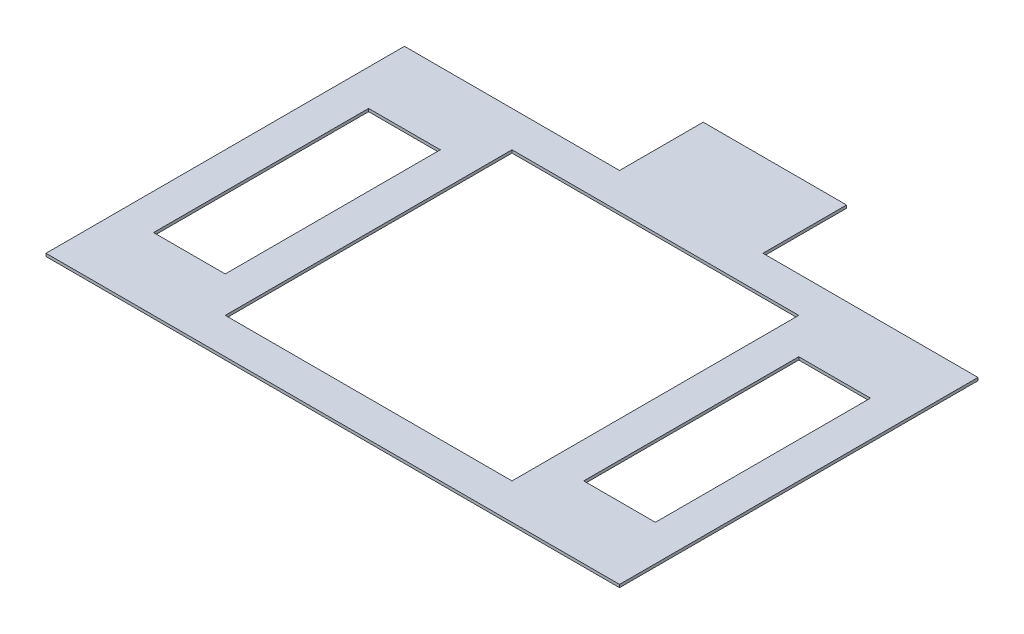
ISO-10303-21;
HEADER;
FILE_DESCRIPTION(('STEP AP214'),'2;1');
FILE_NAME('part.step','',(''),(''),'','','');
FILE_SCHEMA(('AUTOMOTIVE_DESIGN { 1 0 10303 214 1 1 1 1 }'));
ENDSEC;
DATA;
#1=APPLICATION_CONTEXT('core data for automotive mechanical design processes');
#2=APPLICATION_PROTOCOL_DEFINITION('international standard','automotive_design',2000,#1);
#3=PRODUCT_CONTEXT('',#1,'mechanical');
#4=PRODUCT('Part','Part','',(#3));
#5=PRODUCT_RELATED_PRODUCT_CATEGORY('part','',(#4));
#6=PRODUCT_DEFINITION_FORMATION('','',#4);
#7=PRODUCT_DEFINITION_CONTEXT('part definition',#1,'design');
#8=PRODUCT_DEFINITION('design','',#6,#7);
#9=PRODUCT_DEFINITION_SHAPE('','',#8);
#10=(LENGTH_UNIT() NAMED_UNIT(*) SI_UNIT(.MILLI.,.METRE.));
#11=(NAMED_UNIT(*) PLANE_ANGLE_UNIT() SI_UNIT($,.RADIAN.));
#12=(NAMED_UNIT(*) SI_UNIT($,.STERADIAN.) SOLID_ANGLE_UNIT());
#13=UNCERTAINTY_MEASURE_WITH_UNIT(LENGTH_MEASURE(1.E-05),#10,'distance_accuracy_value','');
#14=(GEOMETRIC_REPRESENTATION_CONTEXT(3) GLOBAL_UNCERTAINTY_ASSIGNED_CONTEXT((#13)) GLOBAL_UNIT_ASSIGNED_CONTEXT((#10,
#11,#12)) REPRESENTATION_CONTEXT('',''));
#15=CARTESIAN_POINT('',(0.,0.,0.));
#16=DIRECTION('',(0.,0.,1.));
#17=DIRECTION('',(1.,0.,0.));
#18=AXIS2_PLACEMENT_3D('',#15,#16,#17);
#19=CARTESIAN_POINT('',(0.,3.,0.));
#20=DIRECTION('',(0.,-1.,0.));
#21=DIRECTION('',(0.,0.,-1.));
#22=AXIS2_PLACEMENT_3D('',#19,#20,#21);
#23=PLANE('',#22);
#24=DIRECTION('',(0.,0.,1.));
#25=VECTOR('',#24,1.);
#26=CARTESIAN_POINT('',(37.5,3.,-300.));
#27=LINE('',#26,#25);
#28=CARTESIAN_POINT('',(37.5,3.,-300.));
#29=VERTEX_POINT('',#28);
#30=CARTESIAN_POINT('',(37.5,3.,-75.));
#31=VERTEX_POINT('',#30);
#32=EDGE_CURVE('E225',#29,#31,#27,.T.);
#33=ORIENTED_EDGE('',*,*,#32,.F.);
#34=DIRECTION('',(-1.,0.,0.));
#35=VECTOR('',#34,1.);
#36=CARTESIAN_POINT('',(37.5,3.,-300.));
#37=LINE('',#36,#35);
#38=CARTESIAN_POINT('',(112.5,3.,-300.));
#39=VERTEX_POINT('',#38);
#40=EDGE_CURVE('E236',#39,#29,#37,.T.);
#41=ORIENTED_EDGE('',*,*,#40,.F.);
#42=DIRECTION('',(0.,0.,-1.));
#43=VECTOR('',#42,1.);
#44=CARTESIAN_POINT('',(112.5,3.,-300.));
#45=LINE('',#44,#43);
#46=CARTESIAN_POINT('',(112.5,3.,-75.));
#47=VERTEX_POINT('',#46);
#48=EDGE_CURVE('E232',#47,#39,#45,.T.);
#49=ORIENTED_EDGE('',*,*,#48,.F.);
#50=DIRECTION('',(1.,0.,0.));
#51=VECTOR('',#50,1.);
#52=CARTESIAN_POINT('',(37.5,3.,-75.));
#53=LINE('',#52,#51);
#54=EDGE_CURVE('E228',#31,#47,#53,.T.);
#55=ORIENTED_EDGE('',*,*,#54,.F.);
#56=EDGE_LOOP('',(#33,#41,#49,#55));
#57=FACE_BOUND('',#56,.T.);
#58=DIRECTION('',(1.,0.,0.));
#59=VECTOR('',#58,1.);
#60=CARTESIAN_POINT('',(600.,3.,0.));
#61=LINE('',#60,#59);
#62=CARTESIAN_POINT('',(0.,3.,0.));
#63=VERTEX_POINT('',#62);
#64=CARTESIAN_POINT('',(600.,3.,0.));
#65=VERTEX_POINT('',#64);
#66=EDGE_CURVE('E311',#63,#65,#61,.T.);
#67=ORIENTED_EDGE('',*,*,#66,.T.);
#68=DIRECTION('',(0.,0.,-1.));
#69=VECTOR('',#68,1.);
#70=CARTESIAN_POINT('',(600.,3.,-375.));
#71=LINE('',#70,#69);
#72=CARTESIAN_POINT('',(600.,3.,-375.));
#73=VERTEX_POINT('',#72);
#74=EDGE_CURVE('E315',#65,#73,#71,.T.);
#75=ORIENTED_EDGE('',*,*,#74,.T.);
#76=DIRECTION('',(-1.,0.,0.));
#77=VECTOR('',#76,1.);
#78=CARTESIAN_POINT('',(375.,3.,-375.));
#79=LINE('',#78,#77);
#80=CARTESIAN_POINT('',(375.,3.,-375.));
#81=VERTEX_POINT('',#80);
#82=EDGE_CURVE('E319',#73,#81,#79,.T.);
#83=ORIENTED_EDGE('',*,*,#82,.T.);
#84=DIRECTION('',(0.,0.,-1.));
#85=VECTOR('',#84,1.);
#86=CARTESIAN_POINT('',(375.,3.,-462.5));
#87=LINE('',#86,#85);
#88=CARTESIAN_POINT('',(375.,3.,-462.5));
#89=VERTEX_POINT('',#88);
#90=EDGE_CURVE('E322',#81,#89,#87,.T.);
#91=ORIENTED_EDGE('',*,*,#90,.T.);
#92=DIRECTION('',(-1.,0.,0.));
#93=VECTOR('',#92,1.);
#94=CARTESIAN_POINT('',(225.,3.,-462.5));
#95=LINE('',#94,#93);
#96=CARTESIAN_POINT('',(225.,3.,-462.5));
#97=VERTEX_POINT('',#96);
#98=EDGE_CURVE('E325',#89,#97,#95,.T.);
#99=ORIENTED_EDGE('',*,*,#98,.T.);
#100=DIRECTION('',(0.,0.,1.));
#101=VECTOR('',#100,1.);
#102=CARTESIAN_POINT('',(225.,3.,-375.));
#103=LINE('',#102,#101);
#104=CARTESIAN_POINT('',(225.,3.,-375.));
#105=VERTEX_POINT('',#104);
#106=EDGE_CURVE('E328',#97,#105,#103,.T.);
#107=ORIENTED_EDGE('',*,*,#106,.T.);
#108=DIRECTION('',(-1.,0.,0.));
#109=VECTOR('',#108,1.);
#110=CARTESIAN_POINT('',(-1.11022302462516E-13,3.,-375.));
#111=LINE('',#110,#109);
#112=CARTESIAN_POINT('',(-1.11022302462516E-13,3.,-375.));
#113=VERTEX_POINT('',#112);
#114=EDGE_CURVE('E331',#105,#113,#111,.T.);
#115=ORIENTED_EDGE('',*,*,#114,.T.);
#116=DIRECTION('',(0.,0.,1.));
#117=VECTOR('',#116,1.);
#118=CARTESIAN_POINT('',(0.,3.,0.));
#119=LINE('',#118,#117);
#120=EDGE_CURVE('E334',#113,#63,#119,.T.);
#121=ORIENTED_EDGE('',*,*,#120,.T.);
#122=EDGE_LOOP('',(#67,#75,#83,#91,#99,#107,#115,#121));
#123=FACE_BOUND('',#122,.T.);
#124=DIRECTION('',(0.,0.,1.));
#125=VECTOR('',#124,1.);
#126=CARTESIAN_POINT('',(150.,3.,-337.5));
#127=LINE('',#126,#125);
#128=CARTESIAN_POINT('',(150.,3.,-337.5));
#129=VERTEX_POINT('',#128);
#130=CARTESIAN_POINT('',(150.,3.,-37.5));
#131=VERTEX_POINT('',#130);
#132=EDGE_CURVE('E268',#129,#131,#127,.T.);
#133=ORIENTED_EDGE('',*,*,#132,.F.);
#134=DIRECTION('',(-1.,0.,0.));
#135=VECTOR('',#134,1.);
#136=CARTESIAN_POINT('',(150.,3.,-337.5));
#137=LINE('',#136,#135);
#138=CARTESIAN_POINT('',(450.,3.,-337.5));
#139=VERTEX_POINT('',#138);
#140=EDGE_CURVE('E279',#139,#129,#137,.T.);
#141=ORIENTED_EDGE('',*,*,#140,.F.);
#142=DIRECTION('',(0.,0.,-1.));
#143=VECTOR('',#142,1.);
#144=CARTESIAN_POINT('',(450.,3.,-337.5));
#145=LINE('',#144,#143);
#146=CARTESIAN_POINT('',(450.,3.,-37.5));
#147=VERTEX_POINT('',#146);
#148=EDGE_CURVE('E275',#147,#139,#145,.T.);
#149=ORIENTED_EDGE('',*,*,#148,.F.);
#150=DIRECTION('',(1.,0.,0.));
#151=VECTOR('',#150,1.);
#152=CARTESIAN_POINT('',(150.,3.,-37.5));
#153=LINE('',#152,#151);
#154=EDGE_CURVE('E271',#131,#147,#153,.T.);
#155=ORIENTED_EDGE('',*,*,#154,.F.);
#156=EDGE_LOOP('',(#133,#141,#149,#155));
#157=FACE_BOUND('',#156,.T.);
#158=DIRECTION('',(0.,0.,1.));
#159=VECTOR('',#158,1.);
#160=CARTESIAN_POINT('',(487.5,3.,-300.));
#161=LINE('',#160,#159);
#162=CARTESIAN_POINT('',(487.5,3.,-300.));
#163=VERTEX_POINT('',#162);
#164=CARTESIAN_POINT('',(487.5,3.,-75.));
#165=VERTEX_POINT('',#164);
#166=EDGE_CURVE('E177',#163,#165,#161,.T.);
#167=ORIENTED_EDGE('',*,*,#166,.F.);
#168=DIRECTION('',(-1.,0.,0.));
#169=VECTOR('',#168,1.);
#170=CARTESIAN_POINT('',(487.5,3.,-300.));
#171=LINE('',#170,#169);
#172=CARTESIAN_POINT('',(562.5,3.,-300.));
#173=VERTEX_POINT('',#172);
#174=EDGE_CURVE('E203',#173,#163,#171,.T.);
#175=ORIENTED_EDGE('',*,*,#174,.F.);
#176=DIRECTION('',(0.,0.,-1.));
#177=VECTOR('',#176,1.);
#178=CARTESIAN_POINT('',(562.5,3.,-300.));
#179=LINE('',#178,#177);
#180=CARTESIAN_POINT('',(562.5,3.,-75.));
#181=VERTEX_POINT('',#180);
#182=EDGE_CURVE('E199',#181,#173,#179,.T.);
#183=ORIENTED_EDGE('',*,*,#182,.F.);
#184=DIRECTION('',(1.,0.,0.));
#185=VECTOR('',#184,1.);
#186=CARTESIAN_POINT('',(487.5,3.,-75.));
#187=LINE('',#186,#185);
#188=EDGE_CURVE('E186',#165,#181,#187,.T.);
#189=ORIENTED_EDGE('',*,*,#188,.F.);
#190=EDGE_LOOP('',(#167,#175,#183,#189));
#191=FACE_BOUND('',#190,.T.);
#192=ADVANCED_FACE('F39',(#57,#123,#157,#191),#23,.F.);
#193=CARTESIAN_POINT('',(0.,0.,0.));
#194=DIRECTION('',(0.,-1.,0.));
#195=DIRECTION('',(0.,0.,-1.));
#196=AXIS2_PLACEMENT_3D('',#193,#194,#195);
#197=PLANE('',#196);
#198=DIRECTION('',(1.,0.,0.));
#199=VECTOR('',#198,1.);
#200=CARTESIAN_POINT('',(600.,0.,0.));
#201=LINE('',#200,#199);
#202=CARTESIAN_POINT('',(0.,0.,0.));
#203=VERTEX_POINT('',#202);
#204=CARTESIAN_POINT('',(600.,0.,0.));
#205=VERTEX_POINT('',#204);
#206=EDGE_CURVE('E310',#203,#205,#201,.T.);
#207=ORIENTED_EDGE('',*,*,#206,.F.);
#208=DIRECTION('',(0.,0.,1.));
#209=VECTOR('',#208,1.);
#210=CARTESIAN_POINT('',(0.,0.,0.));
#211=LINE('',#210,#209);
#212=CARTESIAN_POINT('',(-1.11022302462516E-13,0.,-375.));
#213=VERTEX_POINT('',#212);
#214=EDGE_CURVE('E316',#213,#203,#211,.T.);
#215=ORIENTED_EDGE('',*,*,#214,.F.);
#216=DIRECTION('',(-1.,0.,0.));
#217=VECTOR('',#216,1.);
#218=CARTESIAN_POINT('',(-1.11022302462516E-13,0.,-375.));
#219=LINE('',#218,#217);
#220=CARTESIAN_POINT('',(225.,0.,-375.));
#221=VERTEX_POINT('',#220);
#222=EDGE_CURVE('E356',#221,#213,#219,.T.);
#223=ORIENTED_EDGE('',*,*,#222,.F.);
#224=DIRECTION('',(0.,0.,1.));
#225=VECTOR('',#224,1.);
#226=CARTESIAN_POINT('',(225.,0.,-375.));
#227=LINE('',#226,#225);
#228=CARTESIAN_POINT('',(225.,0.,-462.5));
#229=VERTEX_POINT('',#228);
#230=EDGE_CURVE('E353',#229,#221,#227,.T.);
#231=ORIENTED_EDGE('',*,*,#230,.F.);
#232=DIRECTION('',(-1.,0.,0.));
#233=VECTOR('',#232,1.);
#234=CARTESIAN_POINT('',(225.,0.,-462.5));
#235=LINE('',#234,#233);
#236=CARTESIAN_POINT('',(375.,0.,-462.5));
#237=VERTEX_POINT('',#236);
#238=EDGE_CURVE('E350',#237,#229,#235,.T.);
#239=ORIENTED_EDGE('',*,*,#238,.F.);
#240=DIRECTION('',(0.,0.,-1.));
#241=VECTOR('',#240,1.);
#242=CARTESIAN_POINT('',(375.,0.,-462.5));
#243=LINE('',#242,#241);
#244=CARTESIAN_POINT('',(375.,0.,-375.));
#245=VERTEX_POINT('',#244);
#246=EDGE_CURVE('E347',#245,#237,#243,.T.);
#247=ORIENTED_EDGE('',*,*,#246,.F.);
#248=DIRECTION('',(-1.,0.,0.));
#249=VECTOR('',#248,1.);
#250=CARTESIAN_POINT('',(375.,0.,-375.));
#251=LINE('',#250,#249);
#252=CARTESIAN_POINT('',(600.,0.,-375.));
#253=VERTEX_POINT('',#252);
#254=EDGE_CURVE('E344',#253,#245,#251,.T.);
#255=ORIENTED_EDGE('',*,*,#254,.F.);
#256=DIRECTION('',(0.,0.,-1.));
#257=VECTOR('',#256,1.);
#258=CARTESIAN_POINT('',(600.,0.,-375.));
#259=LINE('',#258,#257);
#260=EDGE_CURVE('E341',#205,#253,#259,.T.);
#261=ORIENTED_EDGE('',*,*,#260,.F.);
#262=EDGE_LOOP('',(#207,#215,#223,#231,#239,#247,#255,#261));
#263=FACE_BOUND('',#262,.T.);
#264=DIRECTION('',(-1.,0.,0.));
#265=VECTOR('',#264,1.);
#266=CARTESIAN_POINT('',(150.,0.,-337.5));
#267=LINE('',#266,#265);
#268=CARTESIAN_POINT('',(450.,0.,-337.5));
#269=VERTEX_POINT('',#268);
#270=CARTESIAN_POINT('',(150.,0.,-337.5));
#271=VERTEX_POINT('',#270);
#272=EDGE_CURVE('E272',#269,#271,#267,.T.);
#273=ORIENTED_EDGE('',*,*,#272,.T.);
#274=DIRECTION('',(0.,0.,1.));
#275=VECTOR('',#274,1.);
#276=CARTESIAN_POINT('',(150.,0.,-337.5));
#277=LINE('',#276,#275);
#278=CARTESIAN_POINT('',(150.,0.,-37.5));
#279=VERTEX_POINT('',#278);
#280=EDGE_CURVE('E267',#271,#279,#277,.T.);
#281=ORIENTED_EDGE('',*,*,#280,.T.);
#282=DIRECTION('',(1.,0.,0.));
#283=VECTOR('',#282,1.);
#284=CARTESIAN_POINT('',(150.,0.,-37.5));
#285=LINE('',#284,#283);
#286=CARTESIAN_POINT('',(450.,0.,-37.5));
#287=VERTEX_POINT('',#286);
#288=EDGE_CURVE('E286',#279,#287,#285,.T.);
#289=ORIENTED_EDGE('',*,*,#288,.T.);
#290=DIRECTION('',(0.,0.,-1.));
#291=VECTOR('',#290,1.);
#292=CARTESIAN_POINT('',(450.,0.,-337.5));
#293=LINE('',#292,#291);
#294=EDGE_CURVE('E290',#287,#269,#293,.T.);
#295=ORIENTED_EDGE('',*,*,#294,.T.);
#296=EDGE_LOOP('',(#273,#281,#289,#295));
#297=FACE_BOUND('',#296,.T.);
#298=DIRECTION('',(-1.,0.,0.));
#299=VECTOR('',#298,1.);
#300=CARTESIAN_POINT('',(37.5,0.,-300.));
#301=LINE('',#300,#299);
#302=CARTESIAN_POINT('',(112.5,0.,-300.));
#303=VERTEX_POINT('',#302);
#304=CARTESIAN_POINT('',(37.5,0.,-300.));
#305=VERTEX_POINT('',#304);
#306=EDGE_CURVE('E229',#303,#305,#301,.T.);
#307=ORIENTED_EDGE('',*,*,#306,.T.);
#308=DIRECTION('',(0.,0.,1.));
#309=VECTOR('',#308,1.);
#310=CARTESIAN_POINT('',(37.5,0.,-300.));
#311=LINE('',#310,#309);
#312=CARTESIAN_POINT('',(37.5,0.,-75.));
#313=VERTEX_POINT('',#312);
#314=EDGE_CURVE('E195',#305,#313,#311,.T.);
#315=ORIENTED_EDGE('',*,*,#314,.T.);
#316=DIRECTION('',(1.,0.,0.));
#317=VECTOR('',#316,1.);
#318=CARTESIAN_POINT('',(37.5,0.,-75.));
#319=LINE('',#318,#317);
#320=CARTESIAN_POINT('',(112.5,0.,-75.));
#321=VERTEX_POINT('',#320);
#322=EDGE_CURVE('E243',#313,#321,#319,.T.);
#323=ORIENTED_EDGE('',*,*,#322,.T.);
#324=DIRECTION('',(0.,0.,-1.));
#325=VECTOR('',#324,1.);
#326=CARTESIAN_POINT('',(112.5,0.,-300.));
#327=LINE('',#326,#325);
#328=EDGE_CURVE('E247',#321,#303,#327,.T.);
#329=ORIENTED_EDGE('',*,*,#328,.T.);
#330=EDGE_LOOP('',(#307,#315,#323,#329));
#331=FACE_BOUND('',#330,.T.);
#332=DIRECTION('',(-1.,0.,0.));
#333=VECTOR('',#332,1.);
#334=CARTESIAN_POINT('',(487.5,0.,-300.));
#335=LINE('',#334,#333);
#336=CARTESIAN_POINT('',(562.5,0.,-300.));
#337=VERTEX_POINT('',#336);
#338=CARTESIAN_POINT('',(487.5,0.,-300.));
#339=VERTEX_POINT('',#338);
#340=EDGE_CURVE('E187',#337,#339,#335,.T.);
#341=ORIENTED_EDGE('',*,*,#340,.T.);
#342=DIRECTION('',(0.,0.,1.));
#343=VECTOR('',#342,1.);
#344=CARTESIAN_POINT('',(487.5,0.,-300.));
#345=LINE('',#344,#343);
#346=CARTESIAN_POINT('',(487.5,0.,-75.));
#347=VERTEX_POINT('',#346);
#348=EDGE_CURVE('E63',#339,#347,#345,.T.);
#349=ORIENTED_EDGE('',*,*,#348,.T.);
#350=DIRECTION('',(1.,0.,0.));
#351=VECTOR('',#350,1.);
#352=CARTESIAN_POINT('',(487.5,0.,-75.));
#353=LINE('',#352,#351);
#354=CARTESIAN_POINT('',(562.5,0.,-75.));
#355=VERTEX_POINT('',#354);
#356=EDGE_CURVE('E193',#347,#355,#353,.T.);
#357=ORIENTED_EDGE('',*,*,#356,.T.);
#358=DIRECTION('',(0.,0.,-1.));
#359=VECTOR('',#358,1.);
#360=CARTESIAN_POINT('',(562.5,0.,-300.));
#361=LINE('',#360,#359);
#362=EDGE_CURVE('E212',#355,#337,#361,.T.);
#363=ORIENTED_EDGE('',*,*,#362,.T.);
#364=EDGE_LOOP('',(#341,#349,#357,#363));
#365=FACE_BOUND('',#364,.T.);
#366=ADVANCED_FACE('F395',(#263,#297,#331,#365),#197,.T.);
#367=CARTESIAN_POINT('',(600.,3.,0.));
#368=DIRECTION('',(0.,0.,-1.));
#369=DIRECTION('',(-1.,0.,0.));
#370=AXIS2_PLACEMENT_3D('',#367,#368,#369);
#371=PLANE('',#370);
#372=ORIENTED_EDGE('',*,*,#206,.T.);
#373=DIRECTION('',(0.,-1.,0.));
#374=VECTOR('',#373,1.);
#375=CARTESIAN_POINT('',(600.,3.,0.));
#376=LINE('',#375,#374);
#377=EDGE_CURVE('E11',#65,#205,#376,.T.);
#378=ORIENTED_EDGE('',*,*,#377,.F.);
#379=ORIENTED_EDGE('',*,*,#66,.F.);
#380=DIRECTION('',(0.,-1.,0.));
#381=VECTOR('',#380,1.);
#382=CARTESIAN_POINT('',(0.,3.,0.));
#383=LINE('',#382,#381);
#384=EDGE_CURVE('E337',#63,#203,#383,.T.);
#385=ORIENTED_EDGE('',*,*,#384,.T.);
#386=EDGE_LOOP('',(#372,#378,#379,#385));
#387=FACE_BOUND('',#386,.T.);
#388=ADVANCED_FACE('F41',(#387),#371,.F.);
#389=CARTESIAN_POINT('',(600.,3.,-375.));
#390=DIRECTION('',(-1.,0.,0.));
#391=DIRECTION('',(0.,0.,1.));
#392=AXIS2_PLACEMENT_3D('',#389,#390,#391);
#393=PLANE('',#392);
#394=ORIENTED_EDGE('',*,*,#260,.T.);
#395=DIRECTION('',(0.,-1.,0.));
#396=VECTOR('',#395,1.);
#397=CARTESIAN_POINT('',(600.,3.,-375.));
#398=LINE('',#397,#396);
#399=EDGE_CURVE('E48',#73,#253,#398,.T.);
#400=ORIENTED_EDGE('',*,*,#399,.F.);
#401=ORIENTED_EDGE('',*,*,#74,.F.);
#402=ORIENTED_EDGE('',*,*,#377,.T.);
#403=EDGE_LOOP('',(#394,#400,#401,#402));
#404=FACE_BOUND('',#403,.T.);
#405=ADVANCED_FACE('F413',(#404),#393,.F.);
#406=CARTESIAN_POINT('',(375.,3.,-375.));
#407=DIRECTION('',(0.,0.,1.));
#408=DIRECTION('',(1.,0.,0.));
#409=AXIS2_PLACEMENT_3D('',#406,#407,#408);
#410=PLANE('',#409);
#411=ORIENTED_EDGE('',*,*,#254,.T.);
#412=DIRECTION('',(0.,-1.,0.));
#413=VECTOR('',#412,1.);
#414=CARTESIAN_POINT('',(375.,3.,-375.));
#415=LINE('',#414,#413);
#416=EDGE_CURVE('E380',#81,#245,#415,.T.);
#417=ORIENTED_EDGE('',*,*,#416,.F.);
#418=ORIENTED_EDGE('',*,*,#82,.F.);
#419=ORIENTED_EDGE('',*,*,#399,.T.);
#420=EDGE_LOOP('',(#411,#417,#418,#419));
#421=FACE_BOUND('',#420,.T.);
#422=ADVANCED_FACE('F389',(#421),#410,.F.);
#423=CARTESIAN_POINT('',(375.,3.,-462.5));
#424=DIRECTION('',(-1.,0.,0.));
#425=DIRECTION('',(0.,0.,1.));
#426=AXIS2_PLACEMENT_3D('',#423,#424,#425);
#427=PLANE('',#426);
#428=ORIENTED_EDGE('',*,*,#246,.T.);
#429=DIRECTION('',(0.,-1.,0.));
#430=VECTOR('',#429,1.);
#431=CARTESIAN_POINT('',(375.,3.,-462.5));
#432=LINE('',#431,#430);
#433=EDGE_CURVE('E376',#89,#237,#432,.T.);
#434=ORIENTED_EDGE('',*,*,#433,.F.);
#435=ORIENTED_EDGE('',*,*,#90,.F.);
#436=ORIENTED_EDGE('',*,*,#416,.T.);
#437=EDGE_LOOP('',(#428,#434,#435,#436));
#438=FACE_BOUND('',#437,.T.);
#439=ADVANCED_FACE('F401',(#438),#427,.F.);
#440=CARTESIAN_POINT('',(225.,3.,-462.5));
#441=DIRECTION('',(0.,0.,1.));
#442=DIRECTION('',(1.,0.,0.));
#443=AXIS2_PLACEMENT_3D('',#440,#441,#442);
#444=PLANE('',#443);
#445=ORIENTED_EDGE('',*,*,#238,.T.);
#446=DIRECTION('',(0.,-1.,0.));
#447=VECTOR('',#446,1.);
#448=CARTESIAN_POINT('',(225.,3.,-462.5));
#449=LINE('',#448,#447);
#450=EDGE_CURVE('E372',#97,#229,#449,.T.);
#451=ORIENTED_EDGE('',*,*,#450,.F.);
#452=ORIENTED_EDGE('',*,*,#98,.F.);
#453=ORIENTED_EDGE('',*,*,#433,.T.);
#454=EDGE_LOOP('',(#445,#451,#452,#453));
#455=FACE_BOUND('',#454,.T.);
#456=ADVANCED_FACE('F405',(#455),#444,.F.);
#457=CARTESIAN_POINT('',(225.,3.,-375.));
#458=DIRECTION('',(1.,0.,0.));
#459=DIRECTION('',(0.,0.,-1.));
#460=AXIS2_PLACEMENT_3D('',#457,#458,#459);
#461=PLANE('',#460);
#462=ORIENTED_EDGE('',*,*,#230,.T.);
#463=DIRECTION('',(0.,-1.,0.));
#464=VECTOR('',#463,1.);
#465=CARTESIAN_POINT('',(225.,3.,-375.));
#466=LINE('',#465,#464);
#467=EDGE_CURVE('E368',#105,#221,#466,.T.);
#468=ORIENTED_EDGE('',*,*,#467,.F.);
#469=ORIENTED_EDGE('',*,*,#106,.F.);
#470=ORIENTED_EDGE('',*,*,#450,.T.);
#471=EDGE_LOOP('',(#462,#468,#469,#470));
#472=FACE_BOUND('',#471,.T.);
#473=ADVANCED_FACE('F426',(#472),#461,.F.);
#474=CARTESIAN_POINT('',(-1.11022302462516E-13,3.,-375.));
#475=DIRECTION('',(0.,0.,1.));
#476=DIRECTION('',(1.,0.,0.));
#477=AXIS2_PLACEMENT_3D('',#474,#475,#476);
#478=PLANE('',#477);
#479=ORIENTED_EDGE('',*,*,#222,.T.);
#480=DIRECTION('',(0.,-1.,0.));
#481=VECTOR('',#480,1.);
#482=CARTESIAN_POINT('',(-1.11022302462516E-13,3.,-375.));
#483=LINE('',#482,#481);
#484=EDGE_CURVE('E364',#113,#213,#483,.T.);
#485=ORIENTED_EDGE('',*,*,#484,.F.);
#486=ORIENTED_EDGE('',*,*,#114,.F.);
#487=ORIENTED_EDGE('',*,*,#467,.T.);
#488=EDGE_LOOP('',(#479,#485,#486,#487));
#489=FACE_BOUND('',#488,.T.);
#490=ADVANCED_FACE('F424',(#489),#478,.F.);
#491=CARTESIAN_POINT('',(0.,3.,0.));
#492=DIRECTION('',(1.,0.,0.));
#493=DIRECTION('',(0.,0.,-1.));
#494=AXIS2_PLACEMENT_3D('',#491,#492,#493);
#495=PLANE('',#494);
#496=ORIENTED_EDGE('',*,*,#214,.T.);
#497=ORIENTED_EDGE('',*,*,#384,.F.);
#498=ORIENTED_EDGE('',*,*,#120,.F.);
#499=ORIENTED_EDGE('',*,*,#484,.T.);
#500=EDGE_LOOP('',(#496,#497,#498,#499));
#501=FACE_BOUND('',#500,.T.);
#502=ADVANCED_FACE('F419',(#501),#495,.F.);
#503=CARTESIAN_POINT('',(150.,3.,-337.5));
#504=DIRECTION('',(1.,0.,0.));
#505=DIRECTION('',(0.,0.,-1.));
#506=AXIS2_PLACEMENT_3D('',#503,#504,#505);
#507=PLANE('',#506);
#508=ORIENTED_EDGE('',*,*,#280,.F.);
#509=DIRECTION('',(0.,-1.,0.));
#510=VECTOR('',#509,1.);
#511=CARTESIAN_POINT('',(150.,3.,-337.5));
#512=LINE('',#511,#510);
#513=EDGE_CURVE('E282',#129,#271,#512,.T.);
#514=ORIENTED_EDGE('',*,*,#513,.F.);
#515=ORIENTED_EDGE('',*,*,#132,.T.);
#516=DIRECTION('',(0.,-1.,0.));
#517=VECTOR('',#516,1.);
#518=CARTESIAN_POINT('',(150.,3.,-37.5));
#519=LINE('',#518,#517);
#520=EDGE_CURVE('E306',#131,#279,#519,.T.);
#521=ORIENTED_EDGE('',*,*,#520,.T.);
#522=EDGE_LOOP('',(#508,#514,#515,#521));
#523=FACE_BOUND('',#522,.T.);
#524=ADVANCED_FACE('F444',(#523),#507,.T.);
#525=CARTESIAN_POINT('',(150.,3.,-37.5));
#526=DIRECTION('',(0.,0.,-1.));
#527=DIRECTION('',(-1.,0.,0.));
#528=AXIS2_PLACEMENT_3D('',#525,#526,#527);
#529=PLANE('',#528);
#530=ORIENTED_EDGE('',*,*,#288,.F.);
#531=ORIENTED_EDGE('',*,*,#520,.F.);
#532=ORIENTED_EDGE('',*,*,#154,.T.);
#533=DIRECTION('',(0.,-1.,0.));
#534=VECTOR('',#533,1.);
#535=CARTESIAN_POINT('',(450.,3.,-37.5));
#536=LINE('',#535,#534);
#537=EDGE_CURVE('E303',#147,#287,#536,.T.);
#538=ORIENTED_EDGE('',*,*,#537,.T.);
#539=EDGE_LOOP('',(#530,#531,#532,#538));
#540=FACE_BOUND('',#539,.T.);
#541=ADVANCED_FACE('F451',(#540),#529,.T.);
#542=CARTESIAN_POINT('',(450.,3.,-337.5));
#543=DIRECTION('',(-1.,0.,0.));
#544=DIRECTION('',(0.,0.,1.));
#545=AXIS2_PLACEMENT_3D('',#542,#543,#544);
#546=PLANE('',#545);
#547=ORIENTED_EDGE('',*,*,#294,.F.);
#548=ORIENTED_EDGE('',*,*,#537,.F.);
#549=ORIENTED_EDGE('',*,*,#148,.T.);
#550=DIRECTION('',(0.,-1.,0.));
#551=VECTOR('',#550,1.);
#552=CARTESIAN_POINT('',(450.,3.,-337.5));
#553=LINE('',#552,#551);
#554=EDGE_CURVE('E300',#139,#269,#553,.T.);
#555=ORIENTED_EDGE('',*,*,#554,.T.);
#556=EDGE_LOOP('',(#547,#548,#549,#555));
#557=FACE_BOUND('',#556,.T.);
#558=ADVANCED_FACE('F456',(#557),#546,.T.);
#559=CARTESIAN_POINT('',(150.,3.,-337.5));
#560=DIRECTION('',(0.,0.,1.));
#561=DIRECTION('',(1.,0.,0.));
#562=AXIS2_PLACEMENT_3D('',#559,#560,#561);
#563=PLANE('',#562);
#564=ORIENTED_EDGE('',*,*,#272,.F.);
#565=ORIENTED_EDGE('',*,*,#554,.F.);
#566=ORIENTED_EDGE('',*,*,#140,.T.);
#567=ORIENTED_EDGE('',*,*,#513,.T.);
#568=EDGE_LOOP('',(#564,#565,#566,#567));
#569=FACE_BOUND('',#568,.T.);
#570=ADVANCED_FACE('F463',(#569),#563,.T.);
#571=CARTESIAN_POINT('',(37.5,3.,-300.));
#572=DIRECTION('',(1.,0.,0.));
#573=DIRECTION('',(0.,0.,-1.));
#574=AXIS2_PLACEMENT_3D('',#571,#572,#573);
#575=PLANE('',#574);
#576=ORIENTED_EDGE('',*,*,#314,.F.);
#577=DIRECTION('',(0.,-1.,0.));
#578=VECTOR('',#577,1.);
#579=CARTESIAN_POINT('',(37.5,3.,-300.));
#580=LINE('',#579,#578);
#581=EDGE_CURVE('E239',#29,#305,#580,.T.);
#582=ORIENTED_EDGE('',*,*,#581,.F.);
#583=ORIENTED_EDGE('',*,*,#32,.T.);
#584=DIRECTION('',(0.,-1.,0.));
#585=VECTOR('',#584,1.);
#586=CARTESIAN_POINT('',(37.5,3.,-75.));
#587=LINE('',#586,#585);
#588=EDGE_CURVE('E263',#31,#313,#587,.T.);
#589=ORIENTED_EDGE('',*,*,#588,.T.);
#590=EDGE_LOOP('',(#576,#582,#583,#589));
#591=FACE_BOUND('',#590,.T.);
#592=ADVANCED_FACE('F476',(#591),#575,.T.);
#593=CARTESIAN_POINT('',(37.5,3.,-75.));
#594=DIRECTION('',(0.,0.,-1.));
#595=DIRECTION('',(-1.,0.,0.));
#596=AXIS2_PLACEMENT_3D('',#593,#594,#595);
#597=PLANE('',#596);
#598=ORIENTED_EDGE('',*,*,#322,.F.);
#599=ORIENTED_EDGE('',*,*,#588,.F.);
#600=ORIENTED_EDGE('',*,*,#54,.T.);
#601=DIRECTION('',(0.,-1.,0.));
#602=VECTOR('',#601,1.);
#603=CARTESIAN_POINT('',(112.5,3.,-75.));
#604=LINE('',#603,#602);
#605=EDGE_CURVE('E260',#47,#321,#604,.T.);
#606=ORIENTED_EDGE('',*,*,#605,.T.);
#607=EDGE_LOOP('',(#598,#599,#600,#606));
#608=FACE_BOUND('',#607,.T.);
#609=ADVANCED_FACE('F481',(#608),#597,.T.);
#610=CARTESIAN_POINT('',(112.5,3.,-300.));
#611=DIRECTION('',(-1.,0.,0.));
#612=DIRECTION('',(0.,0.,1.));
#613=AXIS2_PLACEMENT_3D('',#610,#611,#612);
#614=PLANE('',#613);
#615=ORIENTED_EDGE('',*,*,#328,.F.);
#616=ORIENTED_EDGE('',*,*,#605,.F.);
#617=ORIENTED_EDGE('',*,*,#48,.T.);
#618=DIRECTION('',(0.,-1.,0.));
#619=VECTOR('',#618,1.);
#620=CARTESIAN_POINT('',(112.5,3.,-300.));
#621=LINE('',#620,#619);
#622=EDGE_CURVE('E257',#39,#303,#621,.T.);
#623=ORIENTED_EDGE('',*,*,#622,.T.);
#624=EDGE_LOOP('',(#615,#616,#617,#623));
#625=FACE_BOUND('',#624,.T.);
#626=ADVANCED_FACE('F485',(#625),#614,.T.);
#627=CARTESIAN_POINT('',(37.5,3.,-300.));
#628=DIRECTION('',(0.,0.,1.));
#629=DIRECTION('',(1.,0.,0.));
#630=AXIS2_PLACEMENT_3D('',#627,#628,#629);
#631=PLANE('',#630);
#632=ORIENTED_EDGE('',*,*,#306,.F.);
#633=ORIENTED_EDGE('',*,*,#622,.F.);
#634=ORIENTED_EDGE('',*,*,#40,.T.);
#635=ORIENTED_EDGE('',*,*,#581,.T.);
#636=EDGE_LOOP('',(#632,#633,#634,#635));
#637=FACE_BOUND('',#636,.T.);
#638=ADVANCED_FACE('F489',(#637),#631,.T.);
#639=CARTESIAN_POINT('',(487.5,3.,-300.));
#640=DIRECTION('',(1.,0.,0.));
#641=DIRECTION('',(0.,0.,-1.));
#642=AXIS2_PLACEMENT_3D('',#639,#640,#641);
#643=PLANE('',#642);
#644=ORIENTED_EDGE('',*,*,#348,.F.);
#645=DIRECTION('',(0.,-1.,0.));
#646=VECTOR('',#645,1.);
#647=CARTESIAN_POINT('',(487.5,3.,-300.));
#648=LINE('',#647,#646);
#649=EDGE_CURVE('E181',#163,#339,#648,.T.);
#650=ORIENTED_EDGE('',*,*,#649,.F.);
#651=ORIENTED_EDGE('',*,*,#166,.T.);
#652=DIRECTION('',(0.,-1.,0.));
#653=VECTOR('',#652,1.);
#654=CARTESIAN_POINT('',(487.5,3.,-75.));
#655=LINE('',#654,#653);
#656=EDGE_CURVE('E180',#165,#347,#655,.T.);
#657=ORIENTED_EDGE('',*,*,#656,.T.);
#658=EDGE_LOOP('',(#644,#650,#651,#657));
#659=FACE_BOUND('',#658,.T.);
#660=ADVANCED_FACE('F179',(#659),#643,.T.);
#661=CARTESIAN_POINT('',(487.5,3.,-75.));
#662=DIRECTION('',(0.,0.,-1.));
#663=DIRECTION('',(-1.,0.,0.));
#664=AXIS2_PLACEMENT_3D('',#661,#662,#663);
#665=PLANE('',#664);
#666=ORIENTED_EDGE('',*,*,#356,.F.);
#667=ORIENTED_EDGE('',*,*,#656,.F.);
#668=ORIENTED_EDGE('',*,*,#188,.T.);
#669=DIRECTION('',(0.,-1.,0.));
#670=VECTOR('',#669,1.);
#671=CARTESIAN_POINT('',(562.5,3.,-75.));
#672=LINE('',#671,#670);
#673=EDGE_CURVE('E196',#181,#355,#672,.T.);
#674=ORIENTED_EDGE('',*,*,#673,.T.);
#675=EDGE_LOOP('',(#666,#667,#668,#674));
#676=FACE_BOUND('',#675,.T.);
#677=ADVANCED_FACE('F190',(#676),#665,.T.);
#678=CARTESIAN_POINT('',(562.5,3.,-300.));
#679=DIRECTION('',(-1.,0.,0.));
#680=DIRECTION('',(0.,0.,1.));
#681=AXIS2_PLACEMENT_3D('',#678,#679,#680);
#682=PLANE('',#681);
#683=ORIENTED_EDGE('',*,*,#362,.F.);
#684=ORIENTED_EDGE('',*,*,#673,.F.);
#685=ORIENTED_EDGE('',*,*,#182,.T.);
#686=DIRECTION('',(0.,-1.,0.));
#687=VECTOR('',#686,1.);
#688=CARTESIAN_POINT('',(562.5,3.,-300.));
#689=LINE('',#688,#687);
#690=EDGE_CURVE('E55',#173,#337,#689,.T.);
#691=ORIENTED_EDGE('',*,*,#690,.T.);
#692=EDGE_LOOP('',(#683,#684,#685,#691));
#693=FACE_BOUND('',#692,.T.);
#694=ADVANCED_FACE('F498',(#693),#682,.T.);
#695=CARTESIAN_POINT('',(487.5,3.,-300.));
#696=DIRECTION('',(0.,0.,1.));
#697=DIRECTION('',(1.,0.,0.));
#698=AXIS2_PLACEMENT_3D('',#695,#696,#697);
#699=PLANE('',#698);
#700=ORIENTED_EDGE('',*,*,#340,.F.);
#701=ORIENTED_EDGE('',*,*,#690,.F.);
#702=ORIENTED_EDGE('',*,*,#174,.T.);
#703=ORIENTED_EDGE('',*,*,#649,.T.);
#704=EDGE_LOOP('',(#700,#701,#702,#703));
#705=FACE_BOUND('',#704,.T.);
#706=ADVANCED_FACE('F501',(#705),#699,.T.);
#707=CLOSED_SHELL('',(#192,#366,#388,#405,#422,#439,#456,#473,#490,#502,#524,#541,#558,#570,
#592,#609,#626,#638,#660,#677,#694,#706));
#708=MANIFOLD_SOLID_BREP('B2',#707);
#709=ADVANCED_BREP_SHAPE_REPRESENTATION('',(#18,#708),#14);
#710=SHAPE_DEFINITION_REPRESENTATION(#9,#709);
ENDSEC;
END-ISO-10303-21;
